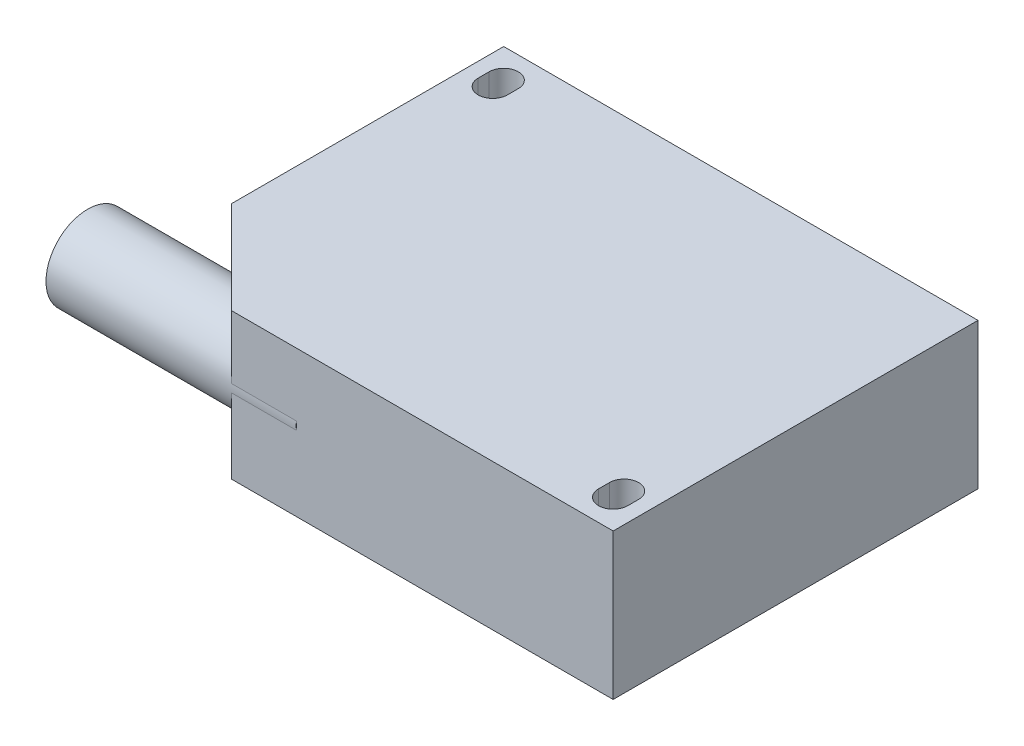
ISO-10303-21;
HEADER;
FILE_DESCRIPTION(('STEP AP214'),'2;1');
FILE_NAME('part.step','',(''),(''),'','','');
FILE_SCHEMA(('AUTOMOTIVE_DESIGN { 1 0 10303 214 1 1 1 1 }'));
ENDSEC;
DATA;
#1=APPLICATION_CONTEXT('core data for automotive mechanical design processes');
#2=APPLICATION_PROTOCOL_DEFINITION('international standard','automotive_design',2000,#1);
#3=PRODUCT_CONTEXT('',#1,'mechanical');
#4=PRODUCT('Part','Part','',(#3));
#5=PRODUCT_RELATED_PRODUCT_CATEGORY('part','',(#4));
#6=PRODUCT_DEFINITION_FORMATION('','',#4);
#7=PRODUCT_DEFINITION_CONTEXT('part definition',#1,'design');
#8=PRODUCT_DEFINITION('design','',#6,#7);
#9=PRODUCT_DEFINITION_SHAPE('','',#8);
#10=(LENGTH_UNIT() NAMED_UNIT(*) SI_UNIT(.MILLI.,.METRE.));
#11=(NAMED_UNIT(*) PLANE_ANGLE_UNIT() SI_UNIT($,.RADIAN.));
#12=(NAMED_UNIT(*) SI_UNIT($,.STERADIAN.) SOLID_ANGLE_UNIT());
#13=UNCERTAINTY_MEASURE_WITH_UNIT(LENGTH_MEASURE(1.E-05),#10,'distance_accuracy_value','');
#14=(GEOMETRIC_REPRESENTATION_CONTEXT(3) GLOBAL_UNCERTAINTY_ASSIGNED_CONTEXT((#13)) GLOBAL_UNIT_ASSIGNED_CONTEXT((#10,
#11,#12)) REPRESENTATION_CONTEXT('',''));
#15=CARTESIAN_POINT('',(0.,0.,0.));
#16=DIRECTION('',(0.,0.,1.));
#17=DIRECTION('',(1.,0.,0.));
#18=AXIS2_PLACEMENT_3D('',#15,#16,#17);
#19=CARTESIAN_POINT('',(32.500000024,20.,-25.));
#20=DIRECTION('',(-1.,0.,0.));
#21=DIRECTION('',(0.,0.,1.));
#22=AXIS2_PLACEMENT_3D('',#19,#20,#21);
#23=PLANE('',#22);
#24=DIRECTION('',(0.,0.,-1.));
#25=VECTOR('',#24,1.);
#26=CARTESIAN_POINT('',(32.500000024,0.,-25.));
#27=LINE('',#26,#25);
#28=CARTESIAN_POINT('',(32.500000024,0.,25.));
#29=VERTEX_POINT('',#28);
#30=CARTESIAN_POINT('',(32.500000024,0.,-25.));
#31=VERTEX_POINT('',#30);
#32=EDGE_CURVE('E215',#29,#31,#27,.T.);
#33=ORIENTED_EDGE('',*,*,#32,.T.);
#34=DIRECTION('',(0.,-1.,0.));
#35=VECTOR('',#34,1.);
#36=CARTESIAN_POINT('',(32.500000024,20.,-25.));
#37=LINE('',#36,#35);
#38=CARTESIAN_POINT('',(32.500000024,20.,-25.));
#39=VERTEX_POINT('',#38);
#40=EDGE_CURVE('E251',#39,#31,#37,.T.);
#41=ORIENTED_EDGE('',*,*,#40,.F.);
#42=DIRECTION('',(0.,0.,-1.));
#43=VECTOR('',#42,1.);
#44=CARTESIAN_POINT('',(32.500000024,20.,-25.));
#45=LINE('',#44,#43);
#46=CARTESIAN_POINT('',(32.500000024,20.,25.));
#47=VERTEX_POINT('',#46);
#48=EDGE_CURVE('E216',#47,#39,#45,.T.);
#49=ORIENTED_EDGE('',*,*,#48,.F.);
#50=DIRECTION('',(0.,-1.,0.));
#51=VECTOR('',#50,1.);
#52=CARTESIAN_POINT('',(32.500000024,20.,25.));
#53=LINE('',#52,#51);
#54=EDGE_CURVE('E228',#47,#29,#53,.T.);
#55=ORIENTED_EDGE('',*,*,#54,.T.);
#56=EDGE_LOOP('',(#33,#41,#49,#55));
#57=FACE_BOUND('',#56,.T.);
#58=ADVANCED_FACE('F34',(#57),#23,.F.);
#59=CARTESIAN_POINT('',(-32.500000024,20.,-25.));
#60=DIRECTION('',(0.,0.,1.));
#61=DIRECTION('',(1.,0.,0.));
#62=AXIS2_PLACEMENT_3D('',#59,#60,#61);
#63=PLANE('',#62);
#64=DIRECTION('',(-1.,0.,0.));
#65=VECTOR('',#64,1.);
#66=CARTESIAN_POINT('',(-32.500000024,0.,-25.));
#67=LINE('',#66,#65);
#68=CARTESIAN_POINT('',(-32.500000024,0.,-25.));
#69=VERTEX_POINT('',#68);
#70=EDGE_CURVE('E231',#31,#69,#67,.T.);
#71=ORIENTED_EDGE('',*,*,#70,.T.);
#72=DIRECTION('',(0.,-1.,0.));
#73=VECTOR('',#72,1.);
#74=CARTESIAN_POINT('',(-32.500000024,20.,-25.));
#75=LINE('',#74,#73);
#76=CARTESIAN_POINT('',(-32.500000024,20.,-25.));
#77=VERTEX_POINT('',#76);
#78=EDGE_CURVE('E248',#77,#69,#75,.T.);
#79=ORIENTED_EDGE('',*,*,#78,.F.);
#80=DIRECTION('',(-1.,0.,0.));
#81=VECTOR('',#80,1.);
#82=CARTESIAN_POINT('',(-32.500000024,20.,-25.));
#83=LINE('',#82,#81);
#84=EDGE_CURVE('E219',#39,#77,#83,.T.);
#85=ORIENTED_EDGE('',*,*,#84,.F.);
#86=ORIENTED_EDGE('',*,*,#40,.T.);
#87=EDGE_LOOP('',(#71,#79,#85,#86));
#88=FACE_BOUND('',#87,.T.);
#89=ADVANCED_FACE('F289',(#88),#63,.F.);
#90=CARTESIAN_POINT('',(-32.500000024,20.,-25.));
#91=DIRECTION('',(1.,0.,0.));
#92=DIRECTION('',(0.,0.,-1.));
#93=AXIS2_PLACEMENT_3D('',#90,#91,#92);
#94=PLANE('',#93);
#95=DIRECTION('',(0.,0.,1.));
#96=VECTOR('',#95,1.);
#97=CARTESIAN_POINT('',(-32.500000024,0.,-25.));
#98=LINE('',#97,#96);
#99=CARTESIAN_POINT('',(-32.500000024,0.,12.3));
#100=VERTEX_POINT('',#99);
#101=EDGE_CURVE('E233',#69,#100,#98,.T.);
#102=ORIENTED_EDGE('',*,*,#101,.T.);
#103=DIRECTION('',(0.,-1.,0.));
#104=VECTOR('',#103,1.);
#105=CARTESIAN_POINT('',(-32.500000024,20.,12.3));
#106=LINE('',#105,#104);
#107=CARTESIAN_POINT('',(-32.500000024,20.,12.3));
#108=VERTEX_POINT('',#107);
#109=EDGE_CURVE('E245',#108,#100,#106,.T.);
#110=ORIENTED_EDGE('',*,*,#109,.F.);
#111=DIRECTION('',(0.,0.,1.));
#112=VECTOR('',#111,1.);
#113=CARTESIAN_POINT('',(-32.500000024,20.,-25.));
#114=LINE('',#113,#112);
#115=EDGE_CURVE('E222',#77,#108,#114,.T.);
#116=ORIENTED_EDGE('',*,*,#115,.F.);
#117=ORIENTED_EDGE('',*,*,#78,.T.);
#118=EDGE_LOOP('',(#102,#110,#116,#117));
#119=FACE_BOUND('',#118,.T.);
#120=ADVANCED_FACE('F287',(#119),#94,.F.);
#121=CARTESIAN_POINT('',(-32.500000024,20.,12.3));
#122=DIRECTION('',(0.707106781186548,0.,-0.707106781186547));
#123=DIRECTION('',(-0.707106781186547,0.,-0.707106781186548));
#124=AXIS2_PLACEMENT_3D('',#121,#122,#123);
#125=PLANE('',#124);
#126=DIRECTION('',(0.,-1.,0.));
#127=VECTOR('',#126,1.);
#128=CARTESIAN_POINT('',(-19.800000024,20.,25.));
#129=LINE('',#128,#127);
#130=CARTESIAN_POINT('',(-19.800000024,10.2426382243385,25.));
#131=VERTEX_POINT('',#130);
#132=CARTESIAN_POINT('',(-19.800000024,0.,25.));
#133=VERTEX_POINT('',#132);
#134=EDGE_CURVE('E241',#131,#133,#129,.T.);
#135=ORIENTED_EDGE('',*,*,#134,.F.);
#136=CARTESIAN_POINT('',(-25.4836359129164,10.795,19.3163641110836));
#137=DIRECTION('',(0.707106781186548,0.,-0.707106781186547));
#138=DIRECTION('',(-0.707106781186547,0.,-0.707106781186548));
#139=AXIS2_PLACEMENT_3D('',#136,#137,#138);
#140=ELLIPSE('',#139,8.07574398417765,5.71041333433848);
#141=CARTESIAN_POINT('',(-19.800000024,11.3473617756615,25.));
#142=VERTEX_POINT('',#141);
#143=EDGE_CURVE('E213',#131,#142,#140,.T.);
#144=ORIENTED_EDGE('',*,*,#143,.T.);
#145=CARTESIAN_POINT('',(-19.800000024,20.,25.));
#146=VERTEX_POINT('',#145);
#147=EDGE_CURVE('E242',#146,#142,#129,.T.);
#148=ORIENTED_EDGE('',*,*,#147,.F.);
#149=DIRECTION('',(0.707106781186547,0.,0.707106781186548));
#150=VECTOR('',#149,1.);
#151=CARTESIAN_POINT('',(-32.500000024,20.,12.3));
#152=LINE('',#151,#150);
#153=EDGE_CURVE('E224',#108,#146,#152,.T.);
#154=ORIENTED_EDGE('',*,*,#153,.F.);
#155=ORIENTED_EDGE('',*,*,#109,.T.);
#156=DIRECTION('',(0.707106781186547,0.,0.707106781186548));
#157=VECTOR('',#156,1.);
#158=CARTESIAN_POINT('',(-32.500000024,0.,12.3));
#159=LINE('',#158,#157);
#160=EDGE_CURVE('E235',#100,#133,#159,.T.);
#161=ORIENTED_EDGE('',*,*,#160,.T.);
#162=EDGE_LOOP('',(#135,#144,#148,#154,#155,#161));
#163=FACE_BOUND('',#162,.T.);
#164=ADVANCED_FACE('F270',(#163),#125,.F.);
#165=CARTESIAN_POINT('',(-19.800000024,20.,25.));
#166=DIRECTION('',(0.,0.,-1.));
#167=DIRECTION('',(-1.,0.,0.));
#168=AXIS2_PLACEMENT_3D('',#165,#166,#167);
#169=PLANE('',#168);
#170=DIRECTION('',(0.,1.,0.));
#171=VECTOR('',#170,1.);
#172=CARTESIAN_POINT('',(-10.910000024,20.,25.));
#173=LINE('',#172,#171);
#174=CARTESIAN_POINT('',(-10.910000024,10.2426382243385,25.));
#175=VERTEX_POINT('',#174);
#176=CARTESIAN_POINT('',(-10.910000024,11.3473617756615,25.));
#177=VERTEX_POINT('',#176);
#178=EDGE_CURVE('E254',#175,#177,#173,.T.);
#179=ORIENTED_EDGE('',*,*,#178,.F.);
#180=DIRECTION('',(-1.,0.,0.));
#181=VECTOR('',#180,1.);
#182=CARTESIAN_POINT('',(-10.910000024,10.2426382243385,25.));
#183=LINE('',#182,#181);
#184=EDGE_CURVE('E11',#175,#131,#183,.T.);
#185=ORIENTED_EDGE('',*,*,#184,.T.);
#186=ORIENTED_EDGE('',*,*,#134,.T.);
#187=DIRECTION('',(1.,0.,0.));
#188=VECTOR('',#187,1.);
#189=CARTESIAN_POINT('',(-19.800000024,0.,25.));
#190=LINE('',#189,#188);
#191=EDGE_CURVE('E220',#133,#29,#190,.T.);
#192=ORIENTED_EDGE('',*,*,#191,.T.);
#193=ORIENTED_EDGE('',*,*,#54,.F.);
#194=DIRECTION('',(1.,0.,0.));
#195=VECTOR('',#194,1.);
#196=CARTESIAN_POINT('',(-19.800000024,20.,25.));
#197=LINE('',#196,#195);
#198=EDGE_CURVE('E226',#146,#47,#197,.T.);
#199=ORIENTED_EDGE('',*,*,#198,.F.);
#200=ORIENTED_EDGE('',*,*,#147,.T.);
#201=DIRECTION('',(-1.,0.,0.));
#202=VECTOR('',#201,1.);
#203=CARTESIAN_POINT('',(-10.910000024,11.3473617756615,25.));
#204=LINE('',#203,#202);
#205=EDGE_CURVE('E41',#142,#177,#204,.F.);
#206=ORIENTED_EDGE('',*,*,#205,.T.);
#207=EDGE_LOOP('',(#179,#185,#186,#192,#193,#199,#200,#206));
#208=FACE_BOUND('',#207,.T.);
#209=ADVANCED_FACE('F258',(#208),#169,.F.);
#210=CARTESIAN_POINT('',(0.,20.,0.));
#211=DIRECTION('',(0.,1.,0.));
#212=DIRECTION('',(0.,0.,1.));
#213=AXIS2_PLACEMENT_3D('',#210,#211,#212);
#214=PLANE('',#213);
#215=CARTESIAN_POINT('',(-28.500000024,20.,-21.));
#216=DIRECTION('',(0.,1.,0.));
#217=DIRECTION('',(0.,0.,1.));
#218=AXIS2_PLACEMENT_3D('',#215,#216,#217);
#219=CIRCLE('',#218,2.);
#220=CARTESIAN_POINT('',(-26.500000024,20.,-21.));
#221=VERTEX_POINT('',#220);
#222=CARTESIAN_POINT('',(-30.500000024,20.,-21.));
#223=VERTEX_POINT('',#222);
#224=EDGE_CURVE('E48',#221,#223,#219,.T.);
#225=ORIENTED_EDGE('',*,*,#224,.F.);
#226=DIRECTION('',(0.,0.,-1.));
#227=VECTOR('',#226,1.);
#228=CARTESIAN_POINT('',(-26.500000024,20.,-21.));
#229=LINE('',#228,#227);
#230=CARTESIAN_POINT('',(-26.500000024,20.,-19.5));
#231=VERTEX_POINT('',#230);
#232=EDGE_CURVE('E157',#231,#221,#229,.T.);
#233=ORIENTED_EDGE('',*,*,#232,.F.);
#234=CARTESIAN_POINT('',(-28.500000024,20.,-19.5));
#235=DIRECTION('',(0.,1.,0.));
#236=DIRECTION('',(0.,0.,1.));
#237=AXIS2_PLACEMENT_3D('',#234,#235,#236);
#238=CIRCLE('',#237,2.);
#239=CARTESIAN_POINT('',(-30.500000024,20.,-19.5));
#240=VERTEX_POINT('',#239);
#241=EDGE_CURVE('E160',#240,#231,#238,.T.);
#242=ORIENTED_EDGE('',*,*,#241,.F.);
#243=DIRECTION('',(0.,0.,1.));
#244=VECTOR('',#243,1.);
#245=CARTESIAN_POINT('',(-30.500000024,20.,-21.));
#246=LINE('',#245,#244);
#247=EDGE_CURVE('E166',#223,#240,#246,.T.);
#248=ORIENTED_EDGE('',*,*,#247,.F.);
#249=EDGE_LOOP('',(#225,#233,#242,#248));
#250=FACE_BOUND('',#249,.T.);
#251=CARTESIAN_POINT('',(28.500000024,20.,19.5));
#252=DIRECTION('',(0.,1.,0.));
#253=DIRECTION('',(0.,0.,1.));
#254=AXIS2_PLACEMENT_3D('',#251,#252,#253);
#255=CIRCLE('',#254,2.);
#256=CARTESIAN_POINT('',(30.500000024,20.,19.5));
#257=VERTEX_POINT('',#256);
#258=CARTESIAN_POINT('',(26.500000024,20.,19.5));
#259=VERTEX_POINT('',#258);
#260=EDGE_CURVE('E172',#257,#259,#255,.T.);
#261=ORIENTED_EDGE('',*,*,#260,.F.);
#262=DIRECTION('',(0.,0.,-1.));
#263=VECTOR('',#262,1.);
#264=CARTESIAN_POINT('',(30.500000024,20.,19.5));
#265=LINE('',#264,#263);
#266=CARTESIAN_POINT('',(30.500000024,20.,21.));
#267=VERTEX_POINT('',#266);
#268=EDGE_CURVE('E180',#267,#257,#265,.T.);
#269=ORIENTED_EDGE('',*,*,#268,.F.);
#270=CARTESIAN_POINT('',(28.500000024,20.,21.));
#271=DIRECTION('',(0.,1.,0.));
#272=DIRECTION('',(0.,0.,1.));
#273=AXIS2_PLACEMENT_3D('',#270,#271,#272);
#274=CIRCLE('',#273,2.);
#275=CARTESIAN_POINT('',(26.500000024,20.,21.));
#276=VERTEX_POINT('',#275);
#277=EDGE_CURVE('E194',#276,#267,#274,.T.);
#278=ORIENTED_EDGE('',*,*,#277,.F.);
#279=DIRECTION('',(0.,0.,1.));
#280=VECTOR('',#279,1.);
#281=CARTESIAN_POINT('',(26.500000024,20.,19.5));
#282=LINE('',#281,#280);
#283=EDGE_CURVE('E191',#259,#276,#282,.T.);
#284=ORIENTED_EDGE('',*,*,#283,.F.);
#285=EDGE_LOOP('',(#261,#269,#278,#284));
#286=FACE_BOUND('',#285,.T.);
#287=ORIENTED_EDGE('',*,*,#48,.T.);
#288=ORIENTED_EDGE('',*,*,#84,.T.);
#289=ORIENTED_EDGE('',*,*,#115,.T.);
#290=ORIENTED_EDGE('',*,*,#153,.T.);
#291=ORIENTED_EDGE('',*,*,#198,.T.);
#292=EDGE_LOOP('',(#287,#288,#289,#290,#291));
#293=FACE_BOUND('',#292,.T.);
#294=ADVANCED_FACE('F283',(#250,#286,#293),#214,.T.);
#295=CARTESIAN_POINT('',(0.,0.,0.));
#296=DIRECTION('',(0.,1.,0.));
#297=DIRECTION('',(0.,0.,1.));
#298=AXIS2_PLACEMENT_3D('',#295,#296,#297);
#299=PLANE('',#298);
#300=DIRECTION('',(0.,0.,-1.));
#301=VECTOR('',#300,1.);
#302=CARTESIAN_POINT('',(-26.500000024,0.,-21.));
#303=LINE('',#302,#301);
#304=CARTESIAN_POINT('',(-26.500000024,0.,-19.5));
#305=VERTEX_POINT('',#304);
#306=CARTESIAN_POINT('',(-26.500000024,0.,-21.));
#307=VERTEX_POINT('',#306);
#308=EDGE_CURVE('E147',#305,#307,#303,.T.);
#309=ORIENTED_EDGE('',*,*,#308,.T.);
#310=CARTESIAN_POINT('',(-28.500000024,0.,-21.));
#311=DIRECTION('',(0.,1.,0.));
#312=DIRECTION('',(0.,0.,1.));
#313=AXIS2_PLACEMENT_3D('',#310,#311,#312);
#314=CIRCLE('',#313,2.);
#315=CARTESIAN_POINT('',(-30.500000024,0.,-21.));
#316=VERTEX_POINT('',#315);
#317=EDGE_CURVE('E141',#307,#316,#314,.T.);
#318=ORIENTED_EDGE('',*,*,#317,.T.);
#319=DIRECTION('',(0.,0.,1.));
#320=VECTOR('',#319,1.);
#321=CARTESIAN_POINT('',(-30.500000024,0.,-21.));
#322=LINE('',#321,#320);
#323=CARTESIAN_POINT('',(-30.500000024,0.,-19.5));
#324=VERTEX_POINT('',#323);
#325=EDGE_CURVE('E150',#316,#324,#322,.T.);
#326=ORIENTED_EDGE('',*,*,#325,.T.);
#327=CARTESIAN_POINT('',(-28.500000024,0.,-19.5));
#328=DIRECTION('',(0.,1.,0.));
#329=DIRECTION('',(0.,0.,1.));
#330=AXIS2_PLACEMENT_3D('',#327,#328,#329);
#331=CIRCLE('',#330,2.);
#332=EDGE_CURVE('E56',#324,#305,#331,.T.);
#333=ORIENTED_EDGE('',*,*,#332,.T.);
#334=EDGE_LOOP('',(#309,#318,#326,#333));
#335=FACE_BOUND('',#334,.T.);
#336=DIRECTION('',(0.,0.,-1.));
#337=VECTOR('',#336,1.);
#338=CARTESIAN_POINT('',(30.500000024,0.,19.5));
#339=LINE('',#338,#337);
#340=CARTESIAN_POINT('',(30.500000024,0.,21.));
#341=VERTEX_POINT('',#340);
#342=CARTESIAN_POINT('',(30.500000024,0.,19.5));
#343=VERTEX_POINT('',#342);
#344=EDGE_CURVE('E186',#341,#343,#339,.T.);
#345=ORIENTED_EDGE('',*,*,#344,.T.);
#346=CARTESIAN_POINT('',(28.500000024,0.,19.5));
#347=DIRECTION('',(0.,1.,0.));
#348=DIRECTION('',(0.,0.,1.));
#349=AXIS2_PLACEMENT_3D('',#346,#347,#348);
#350=CIRCLE('',#349,2.);
#351=CARTESIAN_POINT('',(26.500000024,0.,19.5));
#352=VERTEX_POINT('',#351);
#353=EDGE_CURVE('E176',#343,#352,#350,.T.);
#354=ORIENTED_EDGE('',*,*,#353,.T.);
#355=DIRECTION('',(0.,0.,1.));
#356=VECTOR('',#355,1.);
#357=CARTESIAN_POINT('',(26.500000024,0.,19.5));
#358=LINE('',#357,#356);
#359=CARTESIAN_POINT('',(26.500000024,0.,21.));
#360=VERTEX_POINT('',#359);
#361=EDGE_CURVE('E179',#352,#360,#358,.T.);
#362=ORIENTED_EDGE('',*,*,#361,.T.);
#363=CARTESIAN_POINT('',(28.500000024,0.,21.));
#364=DIRECTION('',(0.,1.,0.));
#365=DIRECTION('',(0.,0.,1.));
#366=AXIS2_PLACEMENT_3D('',#363,#364,#365);
#367=CIRCLE('',#366,2.);
#368=EDGE_CURVE('E183',#360,#341,#367,.T.);
#369=ORIENTED_EDGE('',*,*,#368,.T.);
#370=EDGE_LOOP('',(#345,#354,#362,#369));
#371=FACE_BOUND('',#370,.T.);
#372=ORIENTED_EDGE('',*,*,#32,.F.);
#373=ORIENTED_EDGE('',*,*,#191,.F.);
#374=ORIENTED_EDGE('',*,*,#160,.F.);
#375=ORIENTED_EDGE('',*,*,#101,.F.);
#376=ORIENTED_EDGE('',*,*,#70,.F.);
#377=EDGE_LOOP('',(#372,#373,#374,#375,#376));
#378=FACE_BOUND('',#377,.T.);
#379=ADVANCED_FACE('F154',(#335,#371,#378),#299,.F.);
#380=CARTESIAN_POINT('',(-10.910000024,10.795,19.3163641110836));
#381=DIRECTION('',(-1.,0.,0.));
#382=DIRECTION('',(0.,0.,1.));
#383=AXIS2_PLACEMENT_3D('',#380,#381,#382);
#384=CYLINDRICAL_SURFACE('',#383,5.71041333433848);
#385=CARTESIAN_POINT('',(-45.200000024,10.795,19.3163641110836));
#386=DIRECTION('',(-1.,0.,0.));
#387=DIRECTION('',(0.,0.,1.));
#388=AXIS2_PLACEMENT_3D('',#385,#386,#387);
#389=CIRCLE('',#388,5.71041333433848);
#390=CARTESIAN_POINT('',(-45.200000024,10.795,25.0267774454221));
#391=VERTEX_POINT('',#390);
#392=EDGE_CURVE('E201',#391,#391,#389,.T.);
#393=ORIENTED_EDGE('',*,*,#392,.F.);
#394=EDGE_LOOP('',(#393));
#395=FACE_BOUND('',#394,.T.);
#396=ORIENTED_EDGE('',*,*,#184,.F.);
#397=CARTESIAN_POINT('',(-10.910000024,10.795,19.3163641110836));
#398=DIRECTION('',(-1.,0.,0.));
#399=DIRECTION('',(0.,0.,1.));
#400=AXIS2_PLACEMENT_3D('',#397,#398,#399);
#401=CIRCLE('',#400,5.71041333433848);
#402=EDGE_CURVE('E210',#175,#177,#401,.T.);
#403=ORIENTED_EDGE('',*,*,#402,.T.);
#404=ORIENTED_EDGE('',*,*,#205,.F.);
#405=ORIENTED_EDGE('',*,*,#143,.F.);
#406=EDGE_LOOP('',(#396,#403,#404,#405));
#407=FACE_BOUND('',#406,.T.);
#408=ADVANCED_FACE('F267',(#395,#407),#384,.T.);
#409=CARTESIAN_POINT('',(-10.910000024,10.795,19.3163641110836));
#410=DIRECTION('',(-1.,0.,0.));
#411=DIRECTION('',(0.,0.,1.));
#412=AXIS2_PLACEMENT_3D('',#409,#410,#411);
#413=PLANE('',#412);
#414=ORIENTED_EDGE('',*,*,#402,.F.);
#415=ORIENTED_EDGE('',*,*,#178,.T.);
#416=EDGE_LOOP('',(#414,#415));
#417=FACE_BOUND('',#416,.T.);
#418=ADVANCED_FACE('F266',(#417),#413,.F.);
#419=CARTESIAN_POINT('',(-45.200000024,10.795,19.3163641110836));
#420=DIRECTION('',(-1.,0.,0.));
#421=DIRECTION('',(0.,0.,1.));
#422=AXIS2_PLACEMENT_3D('',#419,#420,#421);
#423=PLANE('',#422);
#424=ORIENTED_EDGE('',*,*,#392,.T.);
#425=EDGE_LOOP('',(#424));
#426=FACE_BOUND('',#425,.T.);
#427=ADVANCED_FACE('F311',(#426),#423,.T.);
#428=CARTESIAN_POINT('',(28.500000024,0.,19.5));
#429=DIRECTION('',(0.,1.,0.));
#430=DIRECTION('',(0.,0.,1.));
#431=AXIS2_PLACEMENT_3D('',#428,#429,#430);
#432=CYLINDRICAL_SURFACE('',#431,2.);
#433=ORIENTED_EDGE('',*,*,#260,.T.);
#434=DIRECTION('',(0.,1.,0.));
#435=VECTOR('',#434,1.);
#436=CARTESIAN_POINT('',(26.500000024,0.,19.5));
#437=LINE('',#436,#435);
#438=EDGE_CURVE('E189',#352,#259,#437,.T.);
#439=ORIENTED_EDGE('',*,*,#438,.F.);
#440=ORIENTED_EDGE('',*,*,#353,.F.);
#441=DIRECTION('',(0.,1.,0.));
#442=VECTOR('',#441,1.);
#443=CARTESIAN_POINT('',(30.500000024,0.,19.5));
#444=LINE('',#443,#442);
#445=EDGE_CURVE('E199',#343,#257,#444,.T.);
#446=ORIENTED_EDGE('',*,*,#445,.T.);
#447=EDGE_LOOP('',(#433,#439,#440,#446));
#448=FACE_BOUND('',#447,.T.);
#449=ADVANCED_FACE('F314',(#448),#432,.F.);
#450=CARTESIAN_POINT('',(30.500000024,0.,19.5));
#451=DIRECTION('',(1.,0.,0.));
#452=DIRECTION('',(0.,0.,-1.));
#453=AXIS2_PLACEMENT_3D('',#450,#451,#452);
#454=PLANE('',#453);
#455=ORIENTED_EDGE('',*,*,#268,.T.);
#456=ORIENTED_EDGE('',*,*,#445,.F.);
#457=ORIENTED_EDGE('',*,*,#344,.F.);
#458=DIRECTION('',(0.,1.,0.));
#459=VECTOR('',#458,1.);
#460=CARTESIAN_POINT('',(30.500000024,0.,21.));
#461=LINE('',#460,#459);
#462=EDGE_CURVE('E202',#341,#267,#461,.T.);
#463=ORIENTED_EDGE('',*,*,#462,.T.);
#464=EDGE_LOOP('',(#455,#456,#457,#463));
#465=FACE_BOUND('',#464,.T.);
#466=ADVANCED_FACE('F318',(#465),#454,.F.);
#467=CARTESIAN_POINT('',(28.500000024,0.,21.));
#468=DIRECTION('',(0.,1.,0.));
#469=DIRECTION('',(0.,0.,1.));
#470=AXIS2_PLACEMENT_3D('',#467,#468,#469);
#471=CYLINDRICAL_SURFACE('',#470,2.);
#472=ORIENTED_EDGE('',*,*,#277,.T.);
#473=ORIENTED_EDGE('',*,*,#462,.F.);
#474=ORIENTED_EDGE('',*,*,#368,.F.);
#475=DIRECTION('',(0.,1.,0.));
#476=VECTOR('',#475,1.);
#477=CARTESIAN_POINT('',(26.500000024,0.,21.));
#478=LINE('',#477,#476);
#479=EDGE_CURVE('E204',#360,#276,#478,.T.);
#480=ORIENTED_EDGE('',*,*,#479,.T.);
#481=EDGE_LOOP('',(#472,#473,#474,#480));
#482=FACE_BOUND('',#481,.T.);
#483=ADVANCED_FACE('F323',(#482),#471,.F.);
#484=CARTESIAN_POINT('',(26.500000024,0.,19.5));
#485=DIRECTION('',(-1.,0.,0.));
#486=DIRECTION('',(0.,0.,1.));
#487=AXIS2_PLACEMENT_3D('',#484,#485,#486);
#488=PLANE('',#487);
#489=ORIENTED_EDGE('',*,*,#283,.T.);
#490=ORIENTED_EDGE('',*,*,#479,.F.);
#491=ORIENTED_EDGE('',*,*,#361,.F.);
#492=ORIENTED_EDGE('',*,*,#438,.T.);
#493=EDGE_LOOP('',(#489,#490,#491,#492));
#494=FACE_BOUND('',#493,.T.);
#495=ADVANCED_FACE('F320',(#494),#488,.F.);
#496=CARTESIAN_POINT('',(-28.500000024,0.,-21.));
#497=DIRECTION('',(0.,1.,0.));
#498=DIRECTION('',(0.,0.,1.));
#499=AXIS2_PLACEMENT_3D('',#496,#497,#498);
#500=CYLINDRICAL_SURFACE('',#499,2.);
#501=ORIENTED_EDGE('',*,*,#224,.T.);
#502=DIRECTION('',(0.,1.,0.));
#503=VECTOR('',#502,1.);
#504=CARTESIAN_POINT('',(-30.500000024,0.,-21.));
#505=LINE('',#504,#503);
#506=EDGE_CURVE('E137',#316,#223,#505,.T.);
#507=ORIENTED_EDGE('',*,*,#506,.F.);
#508=ORIENTED_EDGE('',*,*,#317,.F.);
#509=DIRECTION('',(0.,1.,0.));
#510=VECTOR('',#509,1.);
#511=CARTESIAN_POINT('',(-26.500000024,0.,-21.));
#512=LINE('',#511,#510);
#513=EDGE_CURVE('E170',#307,#221,#512,.T.);
#514=ORIENTED_EDGE('',*,*,#513,.T.);
#515=EDGE_LOOP('',(#501,#507,#508,#514));
#516=FACE_BOUND('',#515,.T.);
#517=ADVANCED_FACE('F139',(#516),#500,.F.);
#518=CARTESIAN_POINT('',(-26.500000024,0.,-21.));
#519=DIRECTION('',(1.,0.,0.));
#520=DIRECTION('',(0.,0.,-1.));
#521=AXIS2_PLACEMENT_3D('',#518,#519,#520);
#522=PLANE('',#521);
#523=ORIENTED_EDGE('',*,*,#232,.T.);
#524=ORIENTED_EDGE('',*,*,#513,.F.);
#525=ORIENTED_EDGE('',*,*,#308,.F.);
#526=DIRECTION('',(0.,1.,0.));
#527=VECTOR('',#526,1.);
#528=CARTESIAN_POINT('',(-26.500000024,0.,-19.5));
#529=LINE('',#528,#527);
#530=EDGE_CURVE('E173',#305,#231,#529,.T.);
#531=ORIENTED_EDGE('',*,*,#530,.T.);
#532=EDGE_LOOP('',(#523,#524,#525,#531));
#533=FACE_BOUND('',#532,.T.);
#534=ADVANCED_FACE('F333',(#533),#522,.F.);
#535=CARTESIAN_POINT('',(-28.500000024,0.,-19.5));
#536=DIRECTION('',(0.,1.,0.));
#537=DIRECTION('',(0.,0.,1.));
#538=AXIS2_PLACEMENT_3D('',#535,#536,#537);
#539=CYLINDRICAL_SURFACE('',#538,2.);
#540=ORIENTED_EDGE('',*,*,#241,.T.);
#541=ORIENTED_EDGE('',*,*,#530,.F.);
#542=ORIENTED_EDGE('',*,*,#332,.F.);
#543=DIRECTION('',(0.,1.,0.));
#544=VECTOR('',#543,1.);
#545=CARTESIAN_POINT('',(-30.500000024,0.,-19.5));
#546=LINE('',#545,#544);
#547=EDGE_CURVE('E146',#324,#240,#546,.T.);
#548=ORIENTED_EDGE('',*,*,#547,.T.);
#549=EDGE_LOOP('',(#540,#541,#542,#548));
#550=FACE_BOUND('',#549,.T.);
#551=ADVANCED_FACE('F336',(#550),#539,.F.);
#552=CARTESIAN_POINT('',(-30.500000024,0.,-21.));
#553=DIRECTION('',(-1.,0.,0.));
#554=DIRECTION('',(0.,0.,1.));
#555=AXIS2_PLACEMENT_3D('',#552,#553,#554);
#556=PLANE('',#555);
#557=ORIENTED_EDGE('',*,*,#247,.T.);
#558=ORIENTED_EDGE('',*,*,#547,.F.);
#559=ORIENTED_EDGE('',*,*,#325,.F.);
#560=ORIENTED_EDGE('',*,*,#506,.T.);
#561=EDGE_LOOP('',(#557,#558,#559,#560));
#562=FACE_BOUND('',#561,.T.);
#563=ADVANCED_FACE('F151',(#562),#556,.F.);
#564=CLOSED_SHELL('',(#58,#89,#120,#164,#209,#294,#379,#408,#418,#427,#449,#466,#483,#495,#517,
#534,#551,#563));
#565=MANIFOLD_SOLID_BREP('B2',#564);
#566=ADVANCED_BREP_SHAPE_REPRESENTATION('',(#18,#565),#14);
#567=SHAPE_DEFINITION_REPRESENTATION(#9,#566);
ENDSEC;
END-ISO-10303-21;
